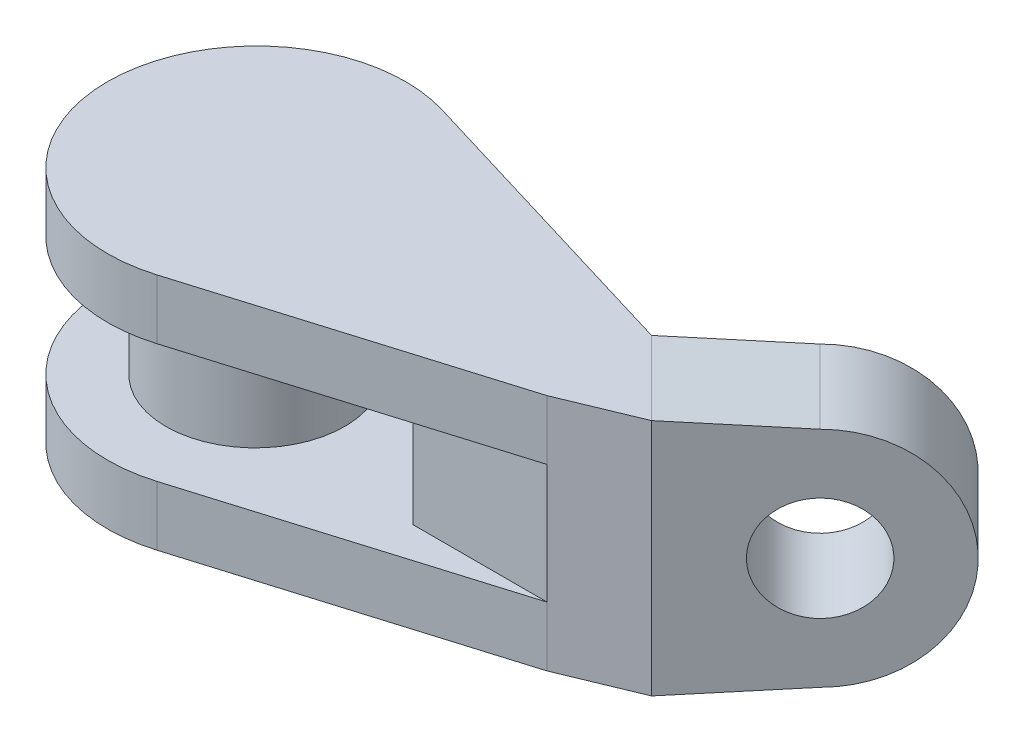
ISO-10303-21;
HEADER;
FILE_DESCRIPTION(('STEP AP214'),'2;1');
FILE_NAME('part.step','',(''),(''),'','','');
FILE_SCHEMA(('AUTOMOTIVE_DESIGN { 1 0 10303 214 1 1 1 1 }'));
ENDSEC;
DATA;
#1=APPLICATION_CONTEXT('core data for automotive mechanical design processes');
#2=APPLICATION_PROTOCOL_DEFINITION('international standard','automotive_design',2000,#1);
#3=PRODUCT_CONTEXT('',#1,'mechanical');
#4=PRODUCT('Part','Part','',(#3));
#5=PRODUCT_RELATED_PRODUCT_CATEGORY('part','',(#4));
#6=PRODUCT_DEFINITION_FORMATION('','',#4);
#7=PRODUCT_DEFINITION_CONTEXT('part definition',#1,'design');
#8=PRODUCT_DEFINITION('design','',#6,#7);
#9=PRODUCT_DEFINITION_SHAPE('','',#8);
#10=(LENGTH_UNIT() NAMED_UNIT(*) SI_UNIT(.MILLI.,.METRE.));
#11=(NAMED_UNIT(*) PLANE_ANGLE_UNIT() SI_UNIT($,.RADIAN.));
#12=(NAMED_UNIT(*) SI_UNIT($,.STERADIAN.) SOLID_ANGLE_UNIT());
#13=UNCERTAINTY_MEASURE_WITH_UNIT(LENGTH_MEASURE(1.E-05),#10,'distance_accuracy_value','');
#14=(GEOMETRIC_REPRESENTATION_CONTEXT(3) GLOBAL_UNCERTAINTY_ASSIGNED_CONTEXT((#13)) GLOBAL_UNIT_ASSIGNED_CONTEXT((#10,
#11,#12)) REPRESENTATION_CONTEXT('',''));
#15=CARTESIAN_POINT('',(0.,0.,0.));
#16=DIRECTION('',(0.,0.,1.));
#17=DIRECTION('',(1.,0.,0.));
#18=AXIS2_PLACEMENT_3D('',#15,#16,#17);
#19=CARTESIAN_POINT('',(0.,20.,17.5));
#20=DIRECTION('',(0.,1.,0.));
#21=DIRECTION('',(0.,0.,1.));
#22=AXIS2_PLACEMENT_3D('',#19,#20,#21);
#23=PLANE('',#22);
#24=DIRECTION('',(1.,0.,0.));
#25=VECTOR('',#24,1.);
#26=CARTESIAN_POINT('',(115.,20.,0.));
#27=LINE('',#26,#25);
#28=CARTESIAN_POINT('',(70.,20.,0.));
#29=VERTEX_POINT('',#28);
#30=CARTESIAN_POINT('',(115.,20.,0.));
#31=VERTEX_POINT('',#30);
#32=EDGE_CURVE('E67',#29,#31,#27,.T.);
#33=ORIENTED_EDGE('',*,*,#32,.F.);
#34=DIRECTION('',(0.,0.,-1.));
#35=VECTOR('',#34,1.);
#36=CARTESIAN_POINT('',(70.,20.,35.));
#37=LINE('',#36,#35);
#38=CARTESIAN_POINT('',(70.,20.,35.));
#39=VERTEX_POINT('',#38);
#40=EDGE_CURVE('E196',#39,#29,#37,.T.);
#41=ORIENTED_EDGE('',*,*,#40,.F.);
#42=DIRECTION('',(-1.,0.,0.));
#43=VECTOR('',#42,1.);
#44=CARTESIAN_POINT('',(115.,20.,35.));
#45=LINE('',#44,#43);
#46=CARTESIAN_POINT('',(115.,20.,35.));
#47=VERTEX_POINT('',#46);
#48=EDGE_CURVE('E60',#47,#39,#45,.T.);
#49=ORIENTED_EDGE('',*,*,#48,.F.);
#50=DIRECTION('',(0.957296785893395,0.,-0.28910701084231));
#51=VECTOR('',#50,1.);
#52=CARTESIAN_POINT('',(14.4553505421155,20.,65.3648392946698));
#53=LINE('',#52,#51);
#54=CARTESIAN_POINT('',(14.4553505421155,20.,65.3648392946698));
#55=VERTEX_POINT('',#54);
#56=EDGE_CURVE('E198',#55,#47,#53,.T.);
#57=ORIENTED_EDGE('',*,*,#56,.F.);
#58=CARTESIAN_POINT('',(0.,20.,17.5));
#59=DIRECTION('',(0.,1.,0.));
#60=DIRECTION('',(0.,0.,1.));
#61=AXIS2_PLACEMENT_3D('',#58,#59,#60);
#62=CIRCLE('',#61,50.);
#63=CARTESIAN_POINT('',(14.4553505421155,20.,-30.3648392946698));
#64=VERTEX_POINT('',#63);
#65=EDGE_CURVE('E207',#64,#55,#62,.T.);
#66=ORIENTED_EDGE('',*,*,#65,.F.);
#67=DIRECTION('',(-0.957296785893395,0.,-0.289107010842309));
#68=VECTOR('',#67,1.);
#69=CARTESIAN_POINT('',(14.4553505421155,20.,-30.3648392946698));
#70=LINE('',#69,#68);
#71=EDGE_CURVE('E204',#31,#64,#70,.T.);
#72=ORIENTED_EDGE('',*,*,#71,.F.);
#73=EDGE_LOOP('',(#33,#41,#49,#57,#66,#72));
#74=FACE_BOUND('',#73,.T.);
#75=CARTESIAN_POINT('',(0.,20.,17.9432347107171));
#76=DIRECTION('',(0.,1.,0.));
#77=DIRECTION('',(0.,0.,1.));
#78=AXIS2_PLACEMENT_3D('',#75,#76,#77);
#79=CIRCLE('',#78,30.);
#80=CARTESIAN_POINT('',(0.,20.,47.9432347107171));
#81=VERTEX_POINT('',#80);
#82=EDGE_CURVE('E321',#81,#81,#79,.T.);
#83=ORIENTED_EDGE('',*,*,#82,.T.);
#84=EDGE_LOOP('',(#83));
#85=FACE_BOUND('',#84,.T.);
#86=ADVANCED_FACE('F43',(#74,#85),#23,.F.);
#87=CARTESIAN_POINT('',(0.,232.937813815747,17.5));
#88=DIRECTION('',(0.,-1.,0.));
#89=DIRECTION('',(0.,0.,-1.));
#90=AXIS2_PLACEMENT_3D('',#87,#88,#89);
#91=CYLINDRICAL_SURFACE('',#90,50.);
#92=DIRECTION('',(0.,-1.,0.));
#93=VECTOR('',#92,1.);
#94=CARTESIAN_POINT('',(14.4553505421155,232.937813815747,65.3648392946698));
#95=LINE('',#94,#93);
#96=CARTESIAN_POINT('',(14.4553505421155,40.,65.3648392946698));
#97=VERTEX_POINT('',#96);
#98=EDGE_CURVE('E210',#97,#55,#95,.T.);
#99=ORIENTED_EDGE('',*,*,#98,.F.);
#100=CARTESIAN_POINT('',(0.,40.,17.5));
#101=DIRECTION('',(0.,-1.,0.));
#102=DIRECTION('',(1.,0.,0.));
#103=AXIS2_PLACEMENT_3D('',#100,#101,#102);
#104=CIRCLE('',#103,50.);
#105=CARTESIAN_POINT('',(14.4553505421155,40.0000000000001,-30.3648392946698));
#106=VERTEX_POINT('',#105);
#107=EDGE_CURVE('E47',#97,#106,#104,.T.);
#108=ORIENTED_EDGE('',*,*,#107,.T.);
#109=DIRECTION('',(0.,-1.,0.));
#110=VECTOR('',#109,1.);
#111=CARTESIAN_POINT('',(14.4553505421155,232.937813815747,-30.3648392946698));
#112=LINE('',#111,#110);
#113=EDGE_CURVE('E212',#106,#64,#112,.T.);
#114=ORIENTED_EDGE('',*,*,#113,.T.);
#115=ORIENTED_EDGE('',*,*,#65,.T.);
#116=EDGE_LOOP('',(#99,#108,#114,#115));
#117=FACE_BOUND('',#116,.T.);
#118=ADVANCED_FACE('F221',(#117),#91,.T.);
#119=CARTESIAN_POINT('',(14.4553505421155,232.937813815747,-30.3648392946698));
#120=DIRECTION('',(-0.289107010842309,0.,0.957296785893395));
#121=DIRECTION('',(0.957296785893395,0.,0.289107010842309));
#122=AXIS2_PLACEMENT_3D('',#119,#120,#121);
#123=PLANE('',#122);
#124=ORIENTED_EDGE('',*,*,#113,.F.);
#125=DIRECTION('',(0.957296785893395,0.,0.289107010842309));
#126=VECTOR('',#125,1.);
#127=CARTESIAN_POINT('',(14.4553505421155,40.,-30.3648392946698));
#128=LINE('',#127,#126);
#129=CARTESIAN_POINT('',(115.,40.,0.));
#130=VERTEX_POINT('',#129);
#131=EDGE_CURVE('E52',#106,#130,#128,.T.);
#132=ORIENTED_EDGE('',*,*,#131,.T.);
#133=DIRECTION('',(0.,-1.,0.));
#134=VECTOR('',#133,1.);
#135=CARTESIAN_POINT('',(115.,232.937813815747,0.));
#136=LINE('',#135,#134);
#137=EDGE_CURVE('E214',#130,#31,#136,.T.);
#138=ORIENTED_EDGE('',*,*,#137,.T.);
#139=ORIENTED_EDGE('',*,*,#71,.T.);
#140=EDGE_LOOP('',(#124,#132,#138,#139));
#141=FACE_BOUND('',#140,.T.);
#142=ADVANCED_FACE('F280',(#141),#123,.F.);
#143=CARTESIAN_POINT('',(14.4553505421155,232.937813815747,65.3648392946698));
#144=DIRECTION('',(-0.28910701084231,0.,-0.957296785893395));
#145=DIRECTION('',(-0.957296785893395,0.,0.28910701084231));
#146=AXIS2_PLACEMENT_3D('',#143,#144,#145);
#147=PLANE('',#146);
#148=DIRECTION('',(0.,-1.,0.));
#149=VECTOR('',#148,1.);
#150=CARTESIAN_POINT('',(115.,232.937813815747,35.));
#151=LINE('',#150,#149);
#152=CARTESIAN_POINT('',(115.,40.,35.));
#153=VERTEX_POINT('',#152);
#154=EDGE_CURVE('E216',#153,#47,#151,.T.);
#155=ORIENTED_EDGE('',*,*,#154,.F.);
#156=DIRECTION('',(-0.957296785893395,0.,0.28910701084231));
#157=VECTOR('',#156,1.);
#158=CARTESIAN_POINT('',(14.4553505421155,40.,65.3648392946698));
#159=LINE('',#158,#157);
#160=EDGE_CURVE('E11',#153,#97,#159,.T.);
#161=ORIENTED_EDGE('',*,*,#160,.T.);
#162=ORIENTED_EDGE('',*,*,#98,.T.);
#163=ORIENTED_EDGE('',*,*,#56,.T.);
#164=EDGE_LOOP('',(#155,#161,#162,#163));
#165=FACE_BOUND('',#164,.T.);
#166=ADVANCED_FACE('F45',(#165),#147,.F.);
#167=CARTESIAN_POINT('',(0.,40.,35.));
#168=DIRECTION('',(0.,-1.,0.));
#169=DIRECTION('',(1.,0.,0.));
#170=AXIS2_PLACEMENT_3D('',#167,#168,#169);
#171=PLANE('',#170);
#172=DIRECTION('',(0.707106781186546,0.,0.707106781186549));
#173=VECTOR('',#172,1.);
#174=CARTESIAN_POINT('',(139.748737341529,40.,24.7487373415292));
#175=LINE('',#174,#173);
#176=CARTESIAN_POINT('',(139.748737341529,40.,24.7487373415292));
#177=VERTEX_POINT('',#176);
#178=EDGE_CURVE('E178',#130,#177,#175,.T.);
#179=ORIENTED_EDGE('',*,*,#178,.F.);
#180=ORIENTED_EDGE('',*,*,#131,.F.);
#181=ORIENTED_EDGE('',*,*,#107,.F.);
#182=ORIENTED_EDGE('',*,*,#160,.F.);
#183=DIRECTION('',(-0.923879532511286,0.,0.382683432365091));
#184=VECTOR('',#183,1.);
#185=CARTESIAN_POINT('',(115.,40.,35.));
#186=LINE('',#185,#184);
#187=EDGE_CURVE('E180',#177,#153,#186,.T.);
#188=ORIENTED_EDGE('',*,*,#187,.F.);
#189=EDGE_LOOP('',(#179,#180,#181,#182,#188));
#190=FACE_BOUND('',#189,.T.);
#191=ADVANCED_FACE('F225',(#190),#171,.F.);
#192=CARTESIAN_POINT('',(0.,0.,35.));
#193=DIRECTION('',(0.,0.,-1.));
#194=DIRECTION('',(-1.,0.,0.));
#195=AXIS2_PLACEMENT_3D('',#192,#193,#194);
#196=PLANE('',#195);
#197=DIRECTION('',(0.,1.,0.));
#198=VECTOR('',#197,1.);
#199=CARTESIAN_POINT('',(115.,40.,35.));
#200=LINE('',#199,#198);
#201=CARTESIAN_POINT('',(115.,-20.,35.));
#202=VERTEX_POINT('',#201);
#203=EDGE_CURVE('E162',#202,#47,#200,.T.);
#204=ORIENTED_EDGE('',*,*,#203,.T.);
#205=ORIENTED_EDGE('',*,*,#48,.T.);
#206=DIRECTION('',(0.,-1.,0.));
#207=VECTOR('',#206,1.);
#208=CARTESIAN_POINT('',(70.,-20.,35.));
#209=LINE('',#208,#207);
#210=CARTESIAN_POINT('',(70.,-20.,35.));
#211=VERTEX_POINT('',#210);
#212=EDGE_CURVE('E163',#39,#211,#209,.T.);
#213=ORIENTED_EDGE('',*,*,#212,.T.);
#214=DIRECTION('',(1.,0.,0.));
#215=VECTOR('',#214,1.);
#216=CARTESIAN_POINT('',(115.,-20.,35.));
#217=LINE('',#216,#215);
#218=EDGE_CURVE('E297',#211,#202,#217,.T.);
#219=ORIENTED_EDGE('',*,*,#218,.T.);
#220=EDGE_LOOP('',(#204,#205,#213,#219));
#221=FACE_BOUND('',#220,.T.);
#222=ADVANCED_FACE('F296',(#221),#196,.F.);
#223=CARTESIAN_POINT('',(0.,0.,0.));
#224=DIRECTION('',(0.,0.,-1.));
#225=DIRECTION('',(-1.,0.,0.));
#226=AXIS2_PLACEMENT_3D('',#223,#224,#225);
#227=PLANE('',#226);
#228=ORIENTED_EDGE('',*,*,#32,.T.);
#229=DIRECTION('',(0.,1.,0.));
#230=VECTOR('',#229,1.);
#231=CARTESIAN_POINT('',(115.,40.,0.));
#232=LINE('',#231,#230);
#233=CARTESIAN_POINT('',(115.,-20.,0.));
#234=VERTEX_POINT('',#233);
#235=EDGE_CURVE('E183',#234,#31,#232,.T.);
#236=ORIENTED_EDGE('',*,*,#235,.F.);
#237=DIRECTION('',(-1.,0.,0.));
#238=VECTOR('',#237,1.);
#239=CARTESIAN_POINT('',(115.,-20.,0.));
#240=LINE('',#239,#238);
#241=CARTESIAN_POINT('',(70.,-20.,0.));
#242=VERTEX_POINT('',#241);
#243=EDGE_CURVE('E300',#234,#242,#240,.T.);
#244=ORIENTED_EDGE('',*,*,#243,.T.);
#245=DIRECTION('',(0.,-1.,0.));
#246=VECTOR('',#245,1.);
#247=CARTESIAN_POINT('',(70.,-20.,0.));
#248=LINE('',#247,#246);
#249=EDGE_CURVE('E191',#29,#242,#248,.T.);
#250=ORIENTED_EDGE('',*,*,#249,.F.);
#251=EDGE_LOOP('',(#228,#236,#244,#250));
#252=FACE_BOUND('',#251,.T.);
#253=ADVANCED_FACE('F336',(#252),#227,.T.);
#254=CARTESIAN_POINT('',(100.,-40.,35.));
#255=DIRECTION('',(0.,1.,0.));
#256=DIRECTION('',(0.,0.,1.));
#257=AXIS2_PLACEMENT_3D('',#254,#255,#256);
#258=PLANE('',#257);
#259=DIRECTION('',(-0.957296785893395,0.,-0.289107010842309));
#260=VECTOR('',#259,1.);
#261=CARTESIAN_POINT('',(14.4553505421155,-40.,-30.3648392946698));
#262=LINE('',#261,#260);
#263=CARTESIAN_POINT('',(115.,-40.,0.));
#264=VERTEX_POINT('',#263);
#265=CARTESIAN_POINT('',(14.4553505421155,-40.,-30.3648392946698));
#266=VERTEX_POINT('',#265);
#267=EDGE_CURVE('E303',#264,#266,#262,.T.);
#268=ORIENTED_EDGE('',*,*,#267,.F.);
#269=DIRECTION('',(0.707106781186546,0.,0.707106781186549));
#270=VECTOR('',#269,1.);
#271=CARTESIAN_POINT('',(139.748737341529,-40.,24.7487373415292));
#272=LINE('',#271,#270);
#273=CARTESIAN_POINT('',(139.748737341529,-40.,24.7487373415292));
#274=VERTEX_POINT('',#273);
#275=EDGE_CURVE('E169',#264,#274,#272,.T.);
#276=ORIENTED_EDGE('',*,*,#275,.T.);
#277=DIRECTION('',(-0.923879532511286,0.,0.382683432365091));
#278=VECTOR('',#277,1.);
#279=CARTESIAN_POINT('',(115.,-40.,35.));
#280=LINE('',#279,#278);
#281=CARTESIAN_POINT('',(115.,-40.,35.));
#282=VERTEX_POINT('',#281);
#283=EDGE_CURVE('E160',#274,#282,#280,.T.);
#284=ORIENTED_EDGE('',*,*,#283,.T.);
#285=DIRECTION('',(0.957296785893395,0.,-0.28910701084231));
#286=VECTOR('',#285,1.);
#287=CARTESIAN_POINT('',(14.4553505421155,-40.,65.3648392946698));
#288=LINE('',#287,#286);
#289=CARTESIAN_POINT('',(14.4553505421155,-40.,65.3648392946698));
#290=VERTEX_POINT('',#289);
#291=EDGE_CURVE('E141',#290,#282,#288,.T.);
#292=ORIENTED_EDGE('',*,*,#291,.F.);
#293=CARTESIAN_POINT('',(0.,-40.,17.5));
#294=DIRECTION('',(0.,1.,0.));
#295=DIRECTION('',(0.,0.,1.));
#296=AXIS2_PLACEMENT_3D('',#293,#294,#295);
#297=CIRCLE('',#296,50.);
#298=EDGE_CURVE('E310',#266,#290,#297,.T.);
#299=ORIENTED_EDGE('',*,*,#298,.F.);
#300=EDGE_LOOP('',(#268,#276,#284,#292,#299));
#301=FACE_BOUND('',#300,.T.);
#302=ADVANCED_FACE('F167',(#301),#258,.F.);
#303=CARTESIAN_POINT('',(70.,-20.,35.));
#304=DIRECTION('',(1.,0.,0.));
#305=DIRECTION('',(0.,0.,-1.));
#306=AXIS2_PLACEMENT_3D('',#303,#304,#305);
#307=PLANE('',#306);
#308=ORIENTED_EDGE('',*,*,#249,.T.);
#309=DIRECTION('',(0.,0.,-1.));
#310=VECTOR('',#309,1.);
#311=CARTESIAN_POINT('',(70.,-20.,35.));
#312=LINE('',#311,#310);
#313=EDGE_CURVE('E187',#211,#242,#312,.T.);
#314=ORIENTED_EDGE('',*,*,#313,.F.);
#315=ORIENTED_EDGE('',*,*,#212,.F.);
#316=ORIENTED_EDGE('',*,*,#40,.T.);
#317=EDGE_LOOP('',(#308,#314,#315,#316));
#318=FACE_BOUND('',#317,.T.);
#319=ADVANCED_FACE('F295',(#318),#307,.F.);
#320=CARTESIAN_POINT('',(0.,-20.,35.));
#321=DIRECTION('',(0.,-1.,0.));
#322=DIRECTION('',(0.,0.,-1.));
#323=AXIS2_PLACEMENT_3D('',#320,#321,#322);
#324=PLANE('',#323);
#325=ORIENTED_EDGE('',*,*,#313,.T.);
#326=ORIENTED_EDGE('',*,*,#243,.F.);
#327=DIRECTION('',(0.957296785893395,0.,0.289107010842309));
#328=VECTOR('',#327,1.);
#329=CARTESIAN_POINT('',(14.4553505421155,-20.,-30.3648392946698));
#330=LINE('',#329,#328);
#331=CARTESIAN_POINT('',(14.4553505421155,-19.9999999999999,-30.3648392946698));
#332=VERTEX_POINT('',#331);
#333=EDGE_CURVE('E309',#332,#234,#330,.T.);
#334=ORIENTED_EDGE('',*,*,#333,.F.);
#335=CARTESIAN_POINT('',(0.,-20.,17.5));
#336=DIRECTION('',(0.,-1.,0.));
#337=DIRECTION('',(1.,0.,0.));
#338=AXIS2_PLACEMENT_3D('',#335,#336,#337);
#339=CIRCLE('',#338,50.);
#340=CARTESIAN_POINT('',(14.4553505421155,-20.,65.3648392946698));
#341=VERTEX_POINT('',#340);
#342=EDGE_CURVE('E315',#341,#332,#339,.T.);
#343=ORIENTED_EDGE('',*,*,#342,.F.);
#344=DIRECTION('',(-0.957296785893395,0.,0.28910701084231));
#345=VECTOR('',#344,1.);
#346=CARTESIAN_POINT('',(14.4553505421155,-20.,65.3648392946698));
#347=LINE('',#346,#345);
#348=EDGE_CURVE('E299',#202,#341,#347,.T.);
#349=ORIENTED_EDGE('',*,*,#348,.F.);
#350=ORIENTED_EDGE('',*,*,#218,.F.);
#351=EDGE_LOOP('',(#325,#326,#334,#343,#349,#350));
#352=FACE_BOUND('',#351,.T.);
#353=CARTESIAN_POINT('',(0.,-20.,17.9432347107171));
#354=DIRECTION('',(0.,1.,0.));
#355=DIRECTION('',(0.,0.,1.));
#356=AXIS2_PLACEMENT_3D('',#353,#354,#355);
#357=CIRCLE('',#356,30.);
#358=CARTESIAN_POINT('',(0.,-20.,47.9432347107171));
#359=VERTEX_POINT('',#358);
#360=EDGE_CURVE('E153',#359,#359,#357,.T.);
#361=ORIENTED_EDGE('',*,*,#360,.F.);
#362=EDGE_LOOP('',(#361));
#363=FACE_BOUND('',#362,.T.);
#364=ADVANCED_FACE('F337',(#352,#363),#324,.F.);
#365=CARTESIAN_POINT('',(115.,82.8660704987056,35.));
#366=DIRECTION('',(-0.382683432365091,0.,-0.923879532511286));
#367=DIRECTION('',(-0.923879532511286,0.,0.382683432365091));
#368=AXIS2_PLACEMENT_3D('',#365,#366,#367);
#369=PLANE('',#368);
#370=DIRECTION('',(0.,-1.,0.));
#371=VECTOR('',#370,1.);
#372=CARTESIAN_POINT('',(139.748737341529,82.8660704987056,24.7487373415292));
#373=LINE('',#372,#371);
#374=EDGE_CURVE('E172',#177,#274,#373,.T.);
#375=ORIENTED_EDGE('',*,*,#374,.F.);
#376=ORIENTED_EDGE('',*,*,#187,.T.);
#377=ORIENTED_EDGE('',*,*,#154,.T.);
#378=ORIENTED_EDGE('',*,*,#203,.F.);
#379=EDGE_CURVE('E145',#282,#202,#200,.T.);
#380=ORIENTED_EDGE('',*,*,#379,.F.);
#381=ORIENTED_EDGE('',*,*,#283,.F.);
#382=EDGE_LOOP('',(#375,#376,#377,#378,#380,#381));
#383=FACE_BOUND('',#382,.T.);
#384=ADVANCED_FACE('F159',(#383),#369,.F.);
#385=CARTESIAN_POINT('',(168.033008588991,-37.5,-3.5355339059327));
#386=DIRECTION('',(0.0441081091391231,-0.998052578482889,-0.0441081091391229));
#387=DIRECTION('',(0.99902486568714,0.0441510785688348,0.));
#388=AXIS2_PLACEMENT_3D('',#385,#386,#387);
#389=PLANE('',#388);
#390=DIRECTION('',(-0.70572974622597,-0.0623782861551804,0.705729746225969));
#391=VECTOR('',#390,1.);
#392=CARTESIAN_POINT('',(143.284271247462,-37.5,-28.2842712474619));
#393=LINE('',#392,#391);
#394=CARTESIAN_POINT('',(143.284271247462,-37.5,-28.2842712474619));
#395=VERTEX_POINT('',#394);
#396=EDGE_CURVE('E243',#395,#264,#393,.T.);
#397=ORIENTED_EDGE('',*,*,#396,.F.);
#398=DIRECTION('',(-0.707106781186547,0.,-0.707106781186549));
#399=VECTOR('',#398,1.);
#400=CARTESIAN_POINT('',(168.033008588991,-37.5,-3.5355339059327));
#401=LINE('',#400,#399);
#402=CARTESIAN_POINT('',(168.033008588991,-37.5,-3.5355339059327));
#403=VERTEX_POINT('',#402);
#404=EDGE_CURVE('E170',#403,#395,#401,.T.);
#405=ORIENTED_EDGE('',*,*,#404,.F.);
#406=DIRECTION('',(-0.70572974622597,-0.0623782861551804,0.705729746225969));
#407=VECTOR('',#406,1.);
#408=CARTESIAN_POINT('',(168.033008588991,-37.5,-3.5355339059327));
#409=LINE('',#408,#407);
#410=EDGE_CURVE('E245',#403,#274,#409,.T.);
#411=ORIENTED_EDGE('',*,*,#410,.T.);
#412=ORIENTED_EDGE('',*,*,#275,.F.);
#413=EDGE_LOOP('',(#397,#405,#411,#412));
#414=FACE_BOUND('',#413,.T.);
#415=ADVANCED_FACE('F265',(#414),#389,.T.);
#416=CARTESIAN_POINT('',(168.033008588991,0.,-3.5355339059327));
#417=DIRECTION('',(-0.707106781186547,0.,-0.707106781186549));
#418=DIRECTION('',(-0.707106781186549,0.,0.707106781186547));
#419=AXIS2_PLACEMENT_3D('',#416,#417,#418);
#420=CYLINDRICAL_SURFACE('',#419,37.5);
#421=CARTESIAN_POINT('',(143.284271247462,0.,-28.2842712474619));
#422=DIRECTION('',(-0.707106781186547,0.,-0.707106781186548));
#423=DIRECTION('',(-0.707106781186548,0.,0.707106781186547));
#424=AXIS2_PLACEMENT_3D('',#421,#422,#423);
#425=CIRCLE('',#424,37.5);
#426=CARTESIAN_POINT('',(143.284271247462,37.5,-28.2842712474619));
#427=VERTEX_POINT('',#426);
#428=EDGE_CURVE('E248',#427,#395,#425,.T.);
#429=ORIENTED_EDGE('',*,*,#428,.F.);
#430=DIRECTION('',(-0.707106781186547,0.,-0.707106781186549));
#431=VECTOR('',#430,1.);
#432=CARTESIAN_POINT('',(168.033008588991,37.5,-3.5355339059327));
#433=LINE('',#432,#431);
#434=CARTESIAN_POINT('',(168.033008588991,37.5,-3.5355339059327));
#435=VERTEX_POINT('',#434);
#436=EDGE_CURVE('E174',#435,#427,#433,.T.);
#437=ORIENTED_EDGE('',*,*,#436,.F.);
#438=CARTESIAN_POINT('',(168.033008588991,0.,-3.5355339059327));
#439=DIRECTION('',(-0.707106781186547,0.,-0.707106781186548));
#440=DIRECTION('',(-0.707106781186548,0.,0.707106781186547));
#441=AXIS2_PLACEMENT_3D('',#438,#439,#440);
#442=CIRCLE('',#441,37.5);
#443=EDGE_CURVE('E242',#435,#403,#442,.T.);
#444=ORIENTED_EDGE('',*,*,#443,.T.);
#445=ORIENTED_EDGE('',*,*,#404,.T.);
#446=EDGE_LOOP('',(#429,#437,#444,#445));
#447=FACE_BOUND('',#446,.T.);
#448=ADVANCED_FACE('F266',(#447),#420,.T.);
#449=CARTESIAN_POINT('',(168.033008588991,37.5,-3.5355339059327));
#450=DIRECTION('',(0.0441081091391239,0.998052578482889,-0.0441081091391238));
#451=DIRECTION('',(-0.99902486568714,0.0441510785688356,0.));
#452=AXIS2_PLACEMENT_3D('',#449,#450,#451);
#453=PLANE('',#452);
#454=DIRECTION('',(0.70572974622597,-0.0623782861551816,-0.705729746225969));
#455=VECTOR('',#454,1.);
#456=CARTESIAN_POINT('',(143.284271247462,37.5,-28.2842712474619));
#457=LINE('',#456,#455);
#458=EDGE_CURVE('E236',#130,#427,#457,.T.);
#459=ORIENTED_EDGE('',*,*,#458,.F.);
#460=ORIENTED_EDGE('',*,*,#178,.T.);
#461=DIRECTION('',(0.70572974622597,-0.0623782861551816,-0.705729746225969));
#462=VECTOR('',#461,1.);
#463=CARTESIAN_POINT('',(168.033008588991,37.5,-3.5355339059327));
#464=LINE('',#463,#462);
#465=EDGE_CURVE('E234',#177,#435,#464,.T.);
#466=ORIENTED_EDGE('',*,*,#465,.T.);
#467=ORIENTED_EDGE('',*,*,#436,.T.);
#468=EDGE_LOOP('',(#459,#460,#466,#467));
#469=FACE_BOUND('',#468,.T.);
#470=ADVANCED_FACE('F233',(#469),#453,.T.);
#471=CARTESIAN_POINT('',(168.033008588991,0.,-3.5355339059327));
#472=DIRECTION('',(-0.707106781186547,0.,-0.707106781186548));
#473=DIRECTION('',(-0.707106781186548,0.,0.707106781186547));
#474=AXIS2_PLACEMENT_3D('',#471,#472,#473);
#475=PLANE('',#474);
#476=CARTESIAN_POINT('',(168.033008588991,0.,-3.5355339059327));
#477=DIRECTION('',(-0.707106781186547,0.,-0.707106781186548));
#478=DIRECTION('',(-0.707106781186548,0.,0.707106781186547));
#479=AXIS2_PLACEMENT_3D('',#476,#477,#478);
#480=CIRCLE('',#479,17.5);
#481=CARTESIAN_POINT('',(155.658639918226,0.,8.83883476483187));
#482=VERTEX_POINT('',#481);
#483=EDGE_CURVE('E256',#482,#482,#480,.T.);
#484=ORIENTED_EDGE('',*,*,#483,.T.);
#485=EDGE_LOOP('',(#484));
#486=FACE_BOUND('',#485,.T.);
#487=ORIENTED_EDGE('',*,*,#374,.T.);
#488=ORIENTED_EDGE('',*,*,#410,.F.);
#489=ORIENTED_EDGE('',*,*,#443,.F.);
#490=ORIENTED_EDGE('',*,*,#465,.F.);
#491=EDGE_LOOP('',(#487,#488,#489,#490));
#492=FACE_BOUND('',#491,.T.);
#493=ADVANCED_FACE('F239',(#486,#492),#475,.F.);
#494=CARTESIAN_POINT('',(143.284271247462,0.,-28.2842712474619));
#495=DIRECTION('',(-0.707106781186547,0.,-0.707106781186548));
#496=DIRECTION('',(-0.707106781186548,0.,0.707106781186547));
#497=AXIS2_PLACEMENT_3D('',#494,#495,#496);
#498=PLANE('',#497);
#499=CARTESIAN_POINT('',(143.284271247462,0.,-28.2842712474619));
#500=DIRECTION('',(-0.707106781186547,0.,-0.707106781186548));
#501=DIRECTION('',(-0.707106781186548,0.,0.707106781186547));
#502=AXIS2_PLACEMENT_3D('',#499,#500,#501);
#503=CIRCLE('',#502,17.5);
#504=CARTESIAN_POINT('',(130.909902576697,0.,-15.9099025766973));
#505=VERTEX_POINT('',#504);
#506=EDGE_CURVE('E251',#505,#505,#503,.T.);
#507=ORIENTED_EDGE('',*,*,#506,.F.);
#508=EDGE_LOOP('',(#507));
#509=FACE_BOUND('',#508,.T.);
#510=EDGE_CURVE('E188',#264,#234,#232,.T.);
#511=ORIENTED_EDGE('',*,*,#510,.T.);
#512=ORIENTED_EDGE('',*,*,#235,.T.);
#513=ORIENTED_EDGE('',*,*,#137,.F.);
#514=ORIENTED_EDGE('',*,*,#458,.T.);
#515=ORIENTED_EDGE('',*,*,#428,.T.);
#516=ORIENTED_EDGE('',*,*,#396,.T.);
#517=EDGE_LOOP('',(#511,#512,#513,#514,#515,#516));
#518=FACE_BOUND('',#517,.T.);
#519=ADVANCED_FACE('F261',(#509,#518),#498,.T.);
#520=CARTESIAN_POINT('',(168.033008588991,0.,-3.5355339059327));
#521=DIRECTION('',(-0.707106781186547,0.,-0.707106781186549));
#522=DIRECTION('',(-0.707106781186549,0.,0.707106781186547));
#523=AXIS2_PLACEMENT_3D('',#520,#521,#522);
#524=CYLINDRICAL_SURFACE('',#523,17.5);
#525=ORIENTED_EDGE('',*,*,#483,.F.);
#526=EDGE_LOOP('',(#525));
#527=FACE_BOUND('',#526,.T.);
#528=ORIENTED_EDGE('',*,*,#506,.T.);
#529=EDGE_LOOP('',(#528));
#530=FACE_BOUND('',#529,.T.);
#531=ADVANCED_FACE('F355',(#527,#530),#524,.F.);
#532=CARTESIAN_POINT('',(0.,172.937813815747,17.5));
#533=DIRECTION('',(0.,-1.,0.));
#534=DIRECTION('',(0.,0.,-1.));
#535=AXIS2_PLACEMENT_3D('',#532,#533,#534);
#536=CYLINDRICAL_SURFACE('',#535,50.);
#537=DIRECTION('',(0.,-1.,0.));
#538=VECTOR('',#537,1.);
#539=CARTESIAN_POINT('',(14.4553505421155,172.937813815747,65.3648392946698));
#540=LINE('',#539,#538);
#541=EDGE_CURVE('E148',#341,#290,#540,.T.);
#542=ORIENTED_EDGE('',*,*,#541,.F.);
#543=ORIENTED_EDGE('',*,*,#342,.T.);
#544=DIRECTION('',(0.,-1.,0.));
#545=VECTOR('',#544,1.);
#546=CARTESIAN_POINT('',(14.4553505421155,172.937813815747,-30.3648392946698));
#547=LINE('',#546,#545);
#548=EDGE_CURVE('E312',#332,#266,#547,.T.);
#549=ORIENTED_EDGE('',*,*,#548,.T.);
#550=ORIENTED_EDGE('',*,*,#298,.T.);
#551=EDGE_LOOP('',(#542,#543,#549,#550));
#552=FACE_BOUND('',#551,.T.);
#553=ADVANCED_FACE('F352',(#552),#536,.T.);
#554=CARTESIAN_POINT('',(14.4553505421155,172.937813815747,-30.3648392946698));
#555=DIRECTION('',(-0.289107010842309,0.,0.957296785893395));
#556=DIRECTION('',(0.957296785893395,0.,0.289107010842309));
#557=AXIS2_PLACEMENT_3D('',#554,#555,#556);
#558=PLANE('',#557);
#559=ORIENTED_EDGE('',*,*,#548,.F.);
#560=ORIENTED_EDGE('',*,*,#333,.T.);
#561=ORIENTED_EDGE('',*,*,#510,.F.);
#562=ORIENTED_EDGE('',*,*,#267,.T.);
#563=EDGE_LOOP('',(#559,#560,#561,#562));
#564=FACE_BOUND('',#563,.T.);
#565=ADVANCED_FACE('F333',(#564),#558,.F.);
#566=CARTESIAN_POINT('',(14.4553505421155,172.937813815747,65.3648392946698));
#567=DIRECTION('',(-0.28910701084231,0.,-0.957296785893395));
#568=DIRECTION('',(-0.957296785893395,0.,0.28910701084231));
#569=AXIS2_PLACEMENT_3D('',#566,#567,#568);
#570=PLANE('',#569);
#571=ORIENTED_EDGE('',*,*,#379,.T.);
#572=ORIENTED_EDGE('',*,*,#348,.T.);
#573=ORIENTED_EDGE('',*,*,#541,.T.);
#574=ORIENTED_EDGE('',*,*,#291,.T.);
#575=EDGE_LOOP('',(#571,#572,#573,#574));
#576=FACE_BOUND('',#575,.T.);
#577=ADVANCED_FACE('F143',(#576),#570,.F.);
#578=CARTESIAN_POINT('',(0.,-20.,17.9432347107171));
#579=DIRECTION('',(0.,1.,0.));
#580=DIRECTION('',(0.,0.,1.));
#581=AXIS2_PLACEMENT_3D('',#578,#579,#580);
#582=CYLINDRICAL_SURFACE('',#581,30.);
#583=ORIENTED_EDGE('',*,*,#360,.T.);
#584=EDGE_LOOP('',(#583));
#585=FACE_BOUND('',#584,.T.);
#586=ORIENTED_EDGE('',*,*,#82,.F.);
#587=EDGE_LOOP('',(#586));
#588=FACE_BOUND('',#587,.T.);
#589=ADVANCED_FACE('F343',(#585,#588),#582,.T.);
#590=CLOSED_SHELL('',(#86,#118,#142,#166,#191,#222,#253,#302,#319,#364,#384,#415,#448,#470,#493,
#519,#531,#553,#565,#577,#589));
#591=MANIFOLD_SOLID_BREP('B2',#590);
#592=ADVANCED_BREP_SHAPE_REPRESENTATION('',(#18,#591),#14);
#593=SHAPE_DEFINITION_REPRESENTATION(#9,#592);
ENDSEC;
END-ISO-10303-21;
